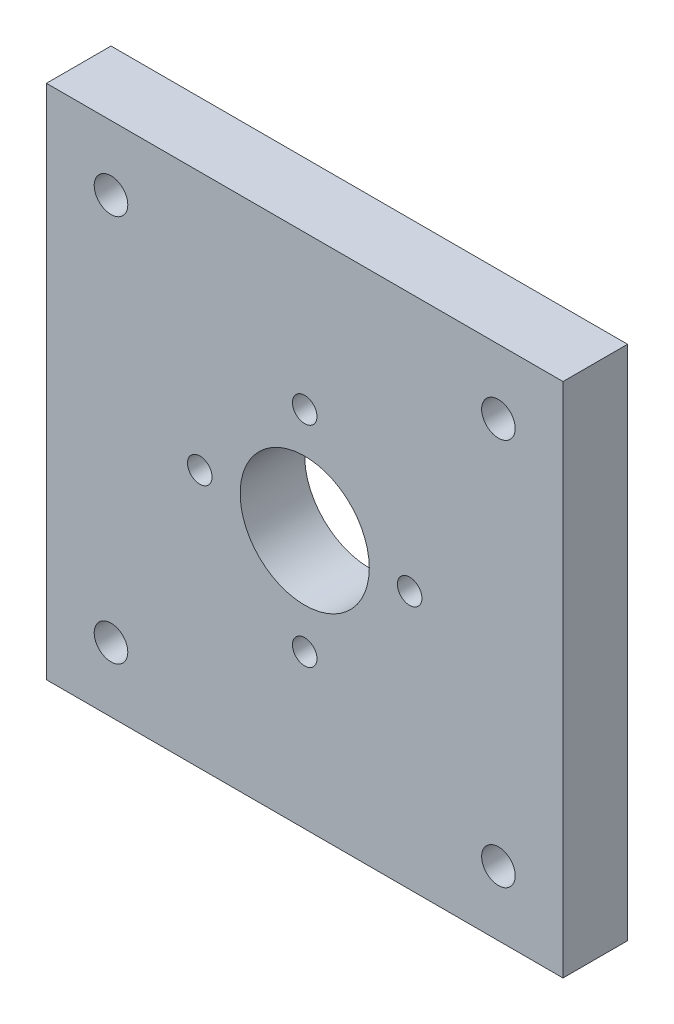
ISO-10303-21;
HEADER;
FILE_DESCRIPTION(('STEP AP214'),'2;1');
FILE_NAME('part.step','',(''),(''),'','','');
FILE_SCHEMA(('AUTOMOTIVE_DESIGN { 1 0 10303 214 1 1 1 1 }'));
ENDSEC;
DATA;
#1=APPLICATION_CONTEXT('core data for automotive mechanical design processes');
#2=APPLICATION_PROTOCOL_DEFINITION('international standard','automotive_design',2000,#1);
#3=PRODUCT_CONTEXT('',#1,'mechanical');
#4=PRODUCT('Part','Part','',(#3));
#5=PRODUCT_RELATED_PRODUCT_CATEGORY('part','',(#4));
#6=PRODUCT_DEFINITION_FORMATION('','',#4);
#7=PRODUCT_DEFINITION_CONTEXT('part definition',#1,'design');
#8=PRODUCT_DEFINITION('design','',#6,#7);
#9=PRODUCT_DEFINITION_SHAPE('','',#8);
#10=(LENGTH_UNIT() NAMED_UNIT(*) SI_UNIT(.MILLI.,.METRE.));
#11=(NAMED_UNIT(*) PLANE_ANGLE_UNIT() SI_UNIT($,.RADIAN.));
#12=(NAMED_UNIT(*) SI_UNIT($,.STERADIAN.) SOLID_ANGLE_UNIT());
#13=UNCERTAINTY_MEASURE_WITH_UNIT(LENGTH_MEASURE(1.E-05),#10,'distance_accuracy_value','');
#14=(GEOMETRIC_REPRESENTATION_CONTEXT(3) GLOBAL_UNCERTAINTY_ASSIGNED_CONTEXT((#13)) GLOBAL_UNIT_ASSIGNED_CONTEXT((#10,
#11,#12)) REPRESENTATION_CONTEXT('',''));
#15=CARTESIAN_POINT('',(0.,0.,0.));
#16=DIRECTION('',(0.,0.,1.));
#17=DIRECTION('',(1.,0.,0.));
#18=AXIS2_PLACEMENT_3D('',#15,#16,#17);
#19=CARTESIAN_POINT('',(0.,0.,0.25));
#20=DIRECTION('',(0.,0.,1.));
#21=DIRECTION('',(1.,0.,0.));
#22=AXIS2_PLACEMENT_3D('',#19,#20,#21);
#23=PLANE('',#22);
#24=CARTESIAN_POINT('',(0.,-1.05391380459484,0.25));
#25=DIRECTION('',(0.,0.,1.));
#26=DIRECTION('',(1.,0.,0.));
#27=AXIS2_PLACEMENT_3D('',#24,#25,#26);
#28=CIRCLE('',#27,0.095);
#29=CARTESIAN_POINT('',(0.095,-1.05391380459484,0.25));
#30=VERTEX_POINT('',#29);
#31=EDGE_CURVE('E155',#30,#30,#28,.T.);
#32=ORIENTED_EDGE('',*,*,#31,.F.);
#33=EDGE_LOOP('',(#32));
#34=FACE_BOUND('',#33,.T.);
#35=CARTESIAN_POINT('',(0.,0.571086195405163,0.25));
#36=DIRECTION('',(0.,0.,1.));
#37=DIRECTION('',(1.,0.,0.));
#38=AXIS2_PLACEMENT_3D('',#35,#36,#37);
#39=CIRCLE('',#38,0.095);
#40=CARTESIAN_POINT('',(0.095,0.571086195405163,0.25));
#41=VERTEX_POINT('',#40);
#42=EDGE_CURVE('E143',#41,#41,#39,.T.);
#43=ORIENTED_EDGE('',*,*,#42,.F.);
#44=EDGE_LOOP('',(#43));
#45=FACE_BOUND('',#44,.T.);
#46=CARTESIAN_POINT('',(1.5,1.25858619539819,0.25));
#47=DIRECTION('',(0.,0.,1.));
#48=DIRECTION('',(-1.,0.,0.));
#49=AXIS2_PLACEMENT_3D('',#46,#47,#48);
#50=CIRCLE('',#49,0.13);
#51=CARTESIAN_POINT('',(1.37,1.25858619539819,0.25));
#52=VERTEX_POINT('',#51);
#53=EDGE_CURVE('E131',#52,#52,#50,.T.);
#54=ORIENTED_EDGE('',*,*,#53,.F.);
#55=EDGE_LOOP('',(#54));
#56=FACE_BOUND('',#55,.T.);
#57=CARTESIAN_POINT('',(-1.5,-1.74141380460181,0.25));
#58=DIRECTION('',(0.,0.,1.));
#59=DIRECTION('',(1.,0.,0.));
#60=AXIS2_PLACEMENT_3D('',#57,#58,#59);
#61=CIRCLE('',#60,0.13);
#62=CARTESIAN_POINT('',(-1.37,-1.74141380460181,0.25));
#63=VERTEX_POINT('',#62);
#64=EDGE_CURVE('E119',#63,#63,#61,.T.);
#65=ORIENTED_EDGE('',*,*,#64,.F.);
#66=EDGE_LOOP('',(#65));
#67=FACE_BOUND('',#66,.T.);
#68=DIRECTION('',(0.,-1.,0.));
#69=VECTOR('',#68,1.);
#70=CARTESIAN_POINT('',(-2.,1.75858619539819,0.25));
#71=LINE('',#70,#69);
#72=CARTESIAN_POINT('',(-2.,1.75858619539819,0.25));
#73=VERTEX_POINT('',#72);
#74=CARTESIAN_POINT('',(-2.,-2.24141380460181,0.25));
#75=VERTEX_POINT('',#74);
#76=EDGE_CURVE('E89',#73,#75,#71,.T.);
#77=ORIENTED_EDGE('',*,*,#76,.T.);
#78=DIRECTION('',(1.,0.,0.));
#79=VECTOR('',#78,1.);
#80=CARTESIAN_POINT('',(-2.,-2.24141380460181,0.25));
#81=LINE('',#80,#79);
#82=CARTESIAN_POINT('',(2.,-2.24141380460181,0.25));
#83=VERTEX_POINT('',#82);
#84=EDGE_CURVE('E84',#75,#83,#81,.T.);
#85=ORIENTED_EDGE('',*,*,#84,.T.);
#86=DIRECTION('',(0.,1.,0.));
#87=VECTOR('',#86,1.);
#88=CARTESIAN_POINT('',(2.,1.75858619539819,0.25));
#89=LINE('',#88,#87);
#90=CARTESIAN_POINT('',(2.,1.75858619539819,0.25));
#91=VERTEX_POINT('',#90);
#92=EDGE_CURVE('E87',#83,#91,#89,.T.);
#93=ORIENTED_EDGE('',*,*,#92,.T.);
#94=DIRECTION('',(-1.,0.,0.));
#95=VECTOR('',#94,1.);
#96=CARTESIAN_POINT('',(2.,1.75858619539819,0.25));
#97=LINE('',#96,#95);
#98=EDGE_CURVE('E54',#91,#73,#97,.T.);
#99=ORIENTED_EDGE('',*,*,#98,.T.);
#100=EDGE_LOOP('',(#77,#85,#93,#99));
#101=FACE_BOUND('',#100,.T.);
#102=CARTESIAN_POINT('',(-1.5,1.25858619539819,0.25));
#103=DIRECTION('',(0.,0.,1.));
#104=DIRECTION('',(1.,0.,0.));
#105=AXIS2_PLACEMENT_3D('',#102,#103,#104);
#106=CIRCLE('',#105,0.13);
#107=CARTESIAN_POINT('',(-1.37,1.25858619539819,0.25));
#108=VERTEX_POINT('',#107);
#109=EDGE_CURVE('E104',#108,#108,#106,.T.);
#110=ORIENTED_EDGE('',*,*,#109,.F.);
#111=EDGE_LOOP('',(#110));
#112=FACE_BOUND('',#111,.T.);
#113=CARTESIAN_POINT('',(1.5,-1.74141380460181,0.25));
#114=DIRECTION('',(0.,0.,1.));
#115=DIRECTION('',(-1.,0.,0.));
#116=AXIS2_PLACEMENT_3D('',#113,#114,#115);
#117=CIRCLE('',#116,0.13);
#118=CARTESIAN_POINT('',(1.37,-1.74141380460181,0.25));
#119=VERTEX_POINT('',#118);
#120=EDGE_CURVE('E125',#119,#119,#117,.T.);
#121=ORIENTED_EDGE('',*,*,#120,.F.);
#122=EDGE_LOOP('',(#121));
#123=FACE_BOUND('',#122,.T.);
#124=CARTESIAN_POINT('',(0.,-0.241413804594837,0.25));
#125=DIRECTION('',(0.,0.,1.));
#126=DIRECTION('',(1.,0.,0.));
#127=AXIS2_PLACEMENT_3D('',#124,#125,#126);
#128=CIRCLE('',#127,0.5);
#129=CARTESIAN_POINT('',(0.5,-0.241413804594837,0.25));
#130=VERTEX_POINT('',#129);
#131=EDGE_CURVE('E137',#130,#130,#128,.T.);
#132=ORIENTED_EDGE('',*,*,#131,.F.);
#133=EDGE_LOOP('',(#132));
#134=FACE_BOUND('',#133,.T.);
#135=CARTESIAN_POINT('',(0.8125,-0.241413804594837,0.25));
#136=DIRECTION('',(0.,0.,1.));
#137=DIRECTION('',(1.,0.,0.));
#138=AXIS2_PLACEMENT_3D('',#135,#136,#137);
#139=CIRCLE('',#138,0.095);
#140=CARTESIAN_POINT('',(0.9075,-0.241413804594837,0.25));
#141=VERTEX_POINT('',#140);
#142=EDGE_CURVE('E149',#141,#141,#139,.T.);
#143=ORIENTED_EDGE('',*,*,#142,.F.);
#144=EDGE_LOOP('',(#143));
#145=FACE_BOUND('',#144,.T.);
#146=CARTESIAN_POINT('',(-0.8125,-0.241413804594837,0.25));
#147=DIRECTION('',(0.,0.,1.));
#148=DIRECTION('',(1.,0.,0.));
#149=AXIS2_PLACEMENT_3D('',#146,#147,#148);
#150=CIRCLE('',#149,0.095);
#151=CARTESIAN_POINT('',(-0.7175,-0.241413804594837,0.25));
#152=VERTEX_POINT('',#151);
#153=EDGE_CURVE('E161',#152,#152,#150,.T.);
#154=ORIENTED_EDGE('',*,*,#153,.F.);
#155=EDGE_LOOP('',(#154));
#156=FACE_BOUND('',#155,.T.);
#157=ADVANCED_FACE('F37',(#34,#45,#56,#67,#101,#112,#123,#134,#145,#156),#23,.T.);
#158=CARTESIAN_POINT('',(0.,0.,-0.25));
#159=DIRECTION('',(0.,0.,1.));
#160=DIRECTION('',(1.,0.,0.));
#161=AXIS2_PLACEMENT_3D('',#158,#159,#160);
#162=PLANE('',#161);
#163=DIRECTION('',(0.,-1.,0.));
#164=VECTOR('',#163,1.);
#165=CARTESIAN_POINT('',(-2.,1.75858619539819,-0.25));
#166=LINE('',#165,#164);
#167=CARTESIAN_POINT('',(-2.,1.75858619539819,-0.25));
#168=VERTEX_POINT('',#167);
#169=CARTESIAN_POINT('',(-2.,-2.24141380460181,-0.25));
#170=VERTEX_POINT('',#169);
#171=EDGE_CURVE('E101',#168,#170,#166,.T.);
#172=ORIENTED_EDGE('',*,*,#171,.F.);
#173=DIRECTION('',(-1.,0.,0.));
#174=VECTOR('',#173,1.);
#175=CARTESIAN_POINT('',(2.,1.75858619539819,-0.25));
#176=LINE('',#175,#174);
#177=CARTESIAN_POINT('',(2.,1.75858619539819,-0.25));
#178=VERTEX_POINT('',#177);
#179=EDGE_CURVE('E77',#178,#168,#176,.T.);
#180=ORIENTED_EDGE('',*,*,#179,.F.);
#181=DIRECTION('',(0.,1.,0.));
#182=VECTOR('',#181,1.);
#183=CARTESIAN_POINT('',(2.,1.75858619539819,-0.25));
#184=LINE('',#183,#182);
#185=CARTESIAN_POINT('',(2.,-2.24141380460181,-0.25));
#186=VERTEX_POINT('',#185);
#187=EDGE_CURVE('E71',#186,#178,#184,.T.);
#188=ORIENTED_EDGE('',*,*,#187,.F.);
#189=DIRECTION('',(1.,0.,0.));
#190=VECTOR('',#189,1.);
#191=CARTESIAN_POINT('',(-2.,-2.24141380460181,-0.25));
#192=LINE('',#191,#190);
#193=EDGE_CURVE('E93',#170,#186,#192,.T.);
#194=ORIENTED_EDGE('',*,*,#193,.F.);
#195=EDGE_LOOP('',(#172,#180,#188,#194));
#196=FACE_BOUND('',#195,.T.);
#197=CARTESIAN_POINT('',(-1.5,1.25858619539819,-0.25));
#198=DIRECTION('',(0.,0.,1.));
#199=DIRECTION('',(1.,0.,0.));
#200=AXIS2_PLACEMENT_3D('',#197,#198,#199);
#201=CIRCLE('',#200,0.13);
#202=CARTESIAN_POINT('',(-1.37,1.25858619539819,-0.25));
#203=VERTEX_POINT('',#202);
#204=EDGE_CURVE('E116',#203,#203,#201,.T.);
#205=ORIENTED_EDGE('',*,*,#204,.T.);
#206=EDGE_LOOP('',(#205));
#207=FACE_BOUND('',#206,.T.);
#208=CARTESIAN_POINT('',(-1.5,-1.74141380460181,-0.25));
#209=DIRECTION('',(0.,0.,1.));
#210=DIRECTION('',(1.,0.,0.));
#211=AXIS2_PLACEMENT_3D('',#208,#209,#210);
#212=CIRCLE('',#211,0.13);
#213=CARTESIAN_POINT('',(-1.37,-1.74141380460181,-0.25));
#214=VERTEX_POINT('',#213);
#215=EDGE_CURVE('E122',#214,#214,#212,.T.);
#216=ORIENTED_EDGE('',*,*,#215,.T.);
#217=EDGE_LOOP('',(#216));
#218=FACE_BOUND('',#217,.T.);
#219=CARTESIAN_POINT('',(1.5,-1.74141380460181,-0.25));
#220=DIRECTION('',(0.,0.,1.));
#221=DIRECTION('',(-1.,0.,0.));
#222=AXIS2_PLACEMENT_3D('',#219,#220,#221);
#223=CIRCLE('',#222,0.13);
#224=CARTESIAN_POINT('',(1.37,-1.74141380460181,-0.25));
#225=VERTEX_POINT('',#224);
#226=EDGE_CURVE('E128',#225,#225,#223,.T.);
#227=ORIENTED_EDGE('',*,*,#226,.T.);
#228=EDGE_LOOP('',(#227));
#229=FACE_BOUND('',#228,.T.);
#230=CARTESIAN_POINT('',(1.5,1.25858619539819,-0.25));
#231=DIRECTION('',(0.,0.,1.));
#232=DIRECTION('',(-1.,0.,0.));
#233=AXIS2_PLACEMENT_3D('',#230,#231,#232);
#234=CIRCLE('',#233,0.13);
#235=CARTESIAN_POINT('',(1.37,1.25858619539819,-0.25));
#236=VERTEX_POINT('',#235);
#237=EDGE_CURVE('E134',#236,#236,#234,.T.);
#238=ORIENTED_EDGE('',*,*,#237,.T.);
#239=EDGE_LOOP('',(#238));
#240=FACE_BOUND('',#239,.T.);
#241=CARTESIAN_POINT('',(0.,-0.241413804594837,-0.25));
#242=DIRECTION('',(0.,0.,1.));
#243=DIRECTION('',(1.,0.,0.));
#244=AXIS2_PLACEMENT_3D('',#241,#242,#243);
#245=CIRCLE('',#244,0.5);
#246=CARTESIAN_POINT('',(0.5,-0.241413804594837,-0.25));
#247=VERTEX_POINT('',#246);
#248=EDGE_CURVE('E140',#247,#247,#245,.T.);
#249=ORIENTED_EDGE('',*,*,#248,.T.);
#250=EDGE_LOOP('',(#249));
#251=FACE_BOUND('',#250,.T.);
#252=CARTESIAN_POINT('',(0.,0.571086195405163,-0.25));
#253=DIRECTION('',(0.,0.,1.));
#254=DIRECTION('',(1.,0.,0.));
#255=AXIS2_PLACEMENT_3D('',#252,#253,#254);
#256=CIRCLE('',#255,0.095);
#257=CARTESIAN_POINT('',(0.095,0.571086195405163,-0.25));
#258=VERTEX_POINT('',#257);
#259=EDGE_CURVE('E146',#258,#258,#256,.T.);
#260=ORIENTED_EDGE('',*,*,#259,.T.);
#261=EDGE_LOOP('',(#260));
#262=FACE_BOUND('',#261,.T.);
#263=CARTESIAN_POINT('',(0.8125,-0.241413804594837,-0.25));
#264=DIRECTION('',(0.,0.,1.));
#265=DIRECTION('',(1.,0.,0.));
#266=AXIS2_PLACEMENT_3D('',#263,#264,#265);
#267=CIRCLE('',#266,0.095);
#268=CARTESIAN_POINT('',(0.9075,-0.241413804594837,-0.25));
#269=VERTEX_POINT('',#268);
#270=EDGE_CURVE('E152',#269,#269,#267,.T.);
#271=ORIENTED_EDGE('',*,*,#270,.T.);
#272=EDGE_LOOP('',(#271));
#273=FACE_BOUND('',#272,.T.);
#274=CARTESIAN_POINT('',(0.,-1.05391380459484,-0.25));
#275=DIRECTION('',(0.,0.,1.));
#276=DIRECTION('',(1.,0.,0.));
#277=AXIS2_PLACEMENT_3D('',#274,#275,#276);
#278=CIRCLE('',#277,0.095);
#279=CARTESIAN_POINT('',(0.095,-1.05391380459484,-0.25));
#280=VERTEX_POINT('',#279);
#281=EDGE_CURVE('E158',#280,#280,#278,.T.);
#282=ORIENTED_EDGE('',*,*,#281,.T.);
#283=EDGE_LOOP('',(#282));
#284=FACE_BOUND('',#283,.T.);
#285=CARTESIAN_POINT('',(-0.8125,-0.241413804594837,-0.25));
#286=DIRECTION('',(0.,0.,1.));
#287=DIRECTION('',(1.,0.,0.));
#288=AXIS2_PLACEMENT_3D('',#285,#286,#287);
#289=CIRCLE('',#288,0.095);
#290=CARTESIAN_POINT('',(-0.7175,-0.241413804594837,-0.25));
#291=VERTEX_POINT('',#290);
#292=EDGE_CURVE('E164',#291,#291,#289,.T.);
#293=ORIENTED_EDGE('',*,*,#292,.T.);
#294=EDGE_LOOP('',(#293));
#295=FACE_BOUND('',#294,.T.);
#296=ADVANCED_FACE('F112',(#196,#207,#218,#229,#240,#251,#262,#273,#284,#295),#162,.F.);
#297=CARTESIAN_POINT('',(-2.,1.75858619539819,0.25));
#298=DIRECTION('',(1.,0.,0.));
#299=DIRECTION('',(0.,1.,0.));
#300=AXIS2_PLACEMENT_3D('',#297,#298,#299);
#301=PLANE('',#300);
#302=ORIENTED_EDGE('',*,*,#171,.T.);
#303=DIRECTION('',(0.,0.,-1.));
#304=VECTOR('',#303,1.);
#305=CARTESIAN_POINT('',(-2.,-2.24141380460181,0.25));
#306=LINE('',#305,#304);
#307=EDGE_CURVE('E11',#75,#170,#306,.T.);
#308=ORIENTED_EDGE('',*,*,#307,.F.);
#309=ORIENTED_EDGE('',*,*,#76,.F.);
#310=DIRECTION('',(0.,0.,-1.));
#311=VECTOR('',#310,1.);
#312=CARTESIAN_POINT('',(-2.,1.75858619539819,0.25));
#313=LINE('',#312,#311);
#314=EDGE_CURVE('E97',#73,#168,#313,.T.);
#315=ORIENTED_EDGE('',*,*,#314,.T.);
#316=EDGE_LOOP('',(#302,#308,#309,#315));
#317=FACE_BOUND('',#316,.T.);
#318=ADVANCED_FACE('F39',(#317),#301,.F.);
#319=CARTESIAN_POINT('',(-2.,-2.24141380460181,0.25));
#320=DIRECTION('',(0.,1.,0.));
#321=DIRECTION('',(0.,0.,1.));
#322=AXIS2_PLACEMENT_3D('',#319,#320,#321);
#323=PLANE('',#322);
#324=ORIENTED_EDGE('',*,*,#193,.T.);
#325=DIRECTION('',(0.,0.,-1.));
#326=VECTOR('',#325,1.);
#327=CARTESIAN_POINT('',(2.,-2.24141380460181,0.25));
#328=LINE('',#327,#326);
#329=EDGE_CURVE('E46',#83,#186,#328,.T.);
#330=ORIENTED_EDGE('',*,*,#329,.F.);
#331=ORIENTED_EDGE('',*,*,#84,.F.);
#332=ORIENTED_EDGE('',*,*,#307,.T.);
#333=EDGE_LOOP('',(#324,#330,#331,#332));
#334=FACE_BOUND('',#333,.T.);
#335=ADVANCED_FACE('F92',(#334),#323,.F.);
#336=CARTESIAN_POINT('',(2.,1.75858619539819,0.25));
#337=DIRECTION('',(-1.,0.,0.));
#338=DIRECTION('',(0.,-1.,0.));
#339=AXIS2_PLACEMENT_3D('',#336,#337,#338);
#340=PLANE('',#339);
#341=ORIENTED_EDGE('',*,*,#187,.T.);
#342=DIRECTION('',(0.,0.,-1.));
#343=VECTOR('',#342,1.);
#344=CARTESIAN_POINT('',(2.,1.75858619539819,0.25));
#345=LINE('',#344,#343);
#346=EDGE_CURVE('E94',#91,#178,#345,.T.);
#347=ORIENTED_EDGE('',*,*,#346,.F.);
#348=ORIENTED_EDGE('',*,*,#92,.F.);
#349=ORIENTED_EDGE('',*,*,#329,.T.);
#350=EDGE_LOOP('',(#341,#347,#348,#349));
#351=FACE_BOUND('',#350,.T.);
#352=ADVANCED_FACE('F95',(#351),#340,.F.);
#353=CARTESIAN_POINT('',(2.,1.75858619539819,0.25));
#354=DIRECTION('',(0.,-1.,0.));
#355=DIRECTION('',(0.,0.,-1.));
#356=AXIS2_PLACEMENT_3D('',#353,#354,#355);
#357=PLANE('',#356);
#358=ORIENTED_EDGE('',*,*,#179,.T.);
#359=ORIENTED_EDGE('',*,*,#314,.F.);
#360=ORIENTED_EDGE('',*,*,#98,.F.);
#361=ORIENTED_EDGE('',*,*,#346,.T.);
#362=EDGE_LOOP('',(#358,#359,#360,#361));
#363=FACE_BOUND('',#362,.T.);
#364=ADVANCED_FACE('F109',(#363),#357,.F.);
#365=CARTESIAN_POINT('',(-1.5,1.25858619539819,0.25));
#366=DIRECTION('',(0.,0.,-1.));
#367=DIRECTION('',(-1.,0.,0.));
#368=AXIS2_PLACEMENT_3D('',#365,#366,#367);
#369=CYLINDRICAL_SURFACE('',#368,0.13);
#370=ORIENTED_EDGE('',*,*,#109,.T.);
#371=EDGE_LOOP('',(#370));
#372=FACE_BOUND('',#371,.T.);
#373=ORIENTED_EDGE('',*,*,#204,.F.);
#374=EDGE_LOOP('',(#373));
#375=FACE_BOUND('',#374,.T.);
#376=ADVANCED_FACE('F183',(#372,#375),#369,.F.);
#377=CARTESIAN_POINT('',(-1.5,-1.74141380460181,0.25));
#378=DIRECTION('',(0.,0.,-1.));
#379=DIRECTION('',(-1.,0.,0.));
#380=AXIS2_PLACEMENT_3D('',#377,#378,#379);
#381=CYLINDRICAL_SURFACE('',#380,0.13);
#382=ORIENTED_EDGE('',*,*,#64,.T.);
#383=EDGE_LOOP('',(#382));
#384=FACE_BOUND('',#383,.T.);
#385=ORIENTED_EDGE('',*,*,#215,.F.);
#386=EDGE_LOOP('',(#385));
#387=FACE_BOUND('',#386,.T.);
#388=ADVANCED_FACE('F237',(#384,#387),#381,.F.);
#389=CARTESIAN_POINT('',(1.5,-1.74141380460181,0.25));
#390=DIRECTION('',(0.,0.,-1.));
#391=DIRECTION('',(-1.,0.,0.));
#392=AXIS2_PLACEMENT_3D('',#389,#390,#391);
#393=CYLINDRICAL_SURFACE('',#392,0.13);
#394=ORIENTED_EDGE('',*,*,#120,.T.);
#395=EDGE_LOOP('',(#394));
#396=FACE_BOUND('',#395,.T.);
#397=ORIENTED_EDGE('',*,*,#226,.F.);
#398=EDGE_LOOP('',(#397));
#399=FACE_BOUND('',#398,.T.);
#400=ADVANCED_FACE('F246',(#396,#399),#393,.F.);
#401=CARTESIAN_POINT('',(1.5,1.25858619539819,0.25));
#402=DIRECTION('',(0.,0.,-1.));
#403=DIRECTION('',(-1.,0.,0.));
#404=AXIS2_PLACEMENT_3D('',#401,#402,#403);
#405=CYLINDRICAL_SURFACE('',#404,0.13);
#406=ORIENTED_EDGE('',*,*,#53,.T.);
#407=EDGE_LOOP('',(#406));
#408=FACE_BOUND('',#407,.T.);
#409=ORIENTED_EDGE('',*,*,#237,.F.);
#410=EDGE_LOOP('',(#409));
#411=FACE_BOUND('',#410,.T.);
#412=ADVANCED_FACE('F255',(#408,#411),#405,.F.);
#413=CARTESIAN_POINT('',(0.,-0.241413804594837,0.25));
#414=DIRECTION('',(0.,0.,-1.));
#415=DIRECTION('',(-1.,0.,0.));
#416=AXIS2_PLACEMENT_3D('',#413,#414,#415);
#417=CYLINDRICAL_SURFACE('',#416,0.5);
#418=ORIENTED_EDGE('',*,*,#131,.T.);
#419=EDGE_LOOP('',(#418));
#420=FACE_BOUND('',#419,.T.);
#421=ORIENTED_EDGE('',*,*,#248,.F.);
#422=EDGE_LOOP('',(#421));
#423=FACE_BOUND('',#422,.T.);
#424=ADVANCED_FACE('F265',(#420,#423),#417,.F.);
#425=CARTESIAN_POINT('',(0.,0.571086195405163,0.25));
#426=DIRECTION('',(0.,0.,-1.));
#427=DIRECTION('',(-1.,0.,0.));
#428=AXIS2_PLACEMENT_3D('',#425,#426,#427);
#429=CYLINDRICAL_SURFACE('',#428,0.095);
#430=ORIENTED_EDGE('',*,*,#42,.T.);
#431=EDGE_LOOP('',(#430));
#432=FACE_BOUND('',#431,.T.);
#433=ORIENTED_EDGE('',*,*,#259,.F.);
#434=EDGE_LOOP('',(#433));
#435=FACE_BOUND('',#434,.T.);
#436=ADVANCED_FACE('F275',(#432,#435),#429,.F.);
#437=CARTESIAN_POINT('',(0.8125,-0.241413804594837,0.25));
#438=DIRECTION('',(0.,0.,-1.));
#439=DIRECTION('',(-1.,0.,0.));
#440=AXIS2_PLACEMENT_3D('',#437,#438,#439);
#441=CYLINDRICAL_SURFACE('',#440,0.095);
#442=ORIENTED_EDGE('',*,*,#142,.T.);
#443=EDGE_LOOP('',(#442));
#444=FACE_BOUND('',#443,.T.);
#445=ORIENTED_EDGE('',*,*,#270,.F.);
#446=EDGE_LOOP('',(#445));
#447=FACE_BOUND('',#446,.T.);
#448=ADVANCED_FACE('F285',(#444,#447),#441,.F.);
#449=CARTESIAN_POINT('',(0.,-1.05391380459484,0.25));
#450=DIRECTION('',(0.,0.,-1.));
#451=DIRECTION('',(-1.,0.,0.));
#452=AXIS2_PLACEMENT_3D('',#449,#450,#451);
#453=CYLINDRICAL_SURFACE('',#452,0.095);
#454=ORIENTED_EDGE('',*,*,#31,.T.);
#455=EDGE_LOOP('',(#454));
#456=FACE_BOUND('',#455,.T.);
#457=ORIENTED_EDGE('',*,*,#281,.F.);
#458=EDGE_LOOP('',(#457));
#459=FACE_BOUND('',#458,.T.);
#460=ADVANCED_FACE('F295',(#456,#459),#453,.F.);
#461=CARTESIAN_POINT('',(-0.8125,-0.241413804594837,0.25));
#462=DIRECTION('',(0.,0.,-1.));
#463=DIRECTION('',(-1.,0.,0.));
#464=AXIS2_PLACEMENT_3D('',#461,#462,#463);
#465=CYLINDRICAL_SURFACE('',#464,0.095);
#466=ORIENTED_EDGE('',*,*,#153,.T.);
#467=EDGE_LOOP('',(#466));
#468=FACE_BOUND('',#467,.T.);
#469=ORIENTED_EDGE('',*,*,#292,.F.);
#470=EDGE_LOOP('',(#469));
#471=FACE_BOUND('',#470,.T.);
#472=ADVANCED_FACE('F170',(#468,#471),#465,.F.);
#473=CLOSED_SHELL('',(#157,#296,#318,#335,#352,#364,#376,#388,#400,#412,#424,#436,#448,#460,#472));
#474=MANIFOLD_SOLID_BREP('B2',#473);
#475=ADVANCED_BREP_SHAPE_REPRESENTATION('',(#18,#474),#14);
#476=SHAPE_DEFINITION_REPRESENTATION(#9,#475);
ENDSEC;
END-ISO-10303-21;
